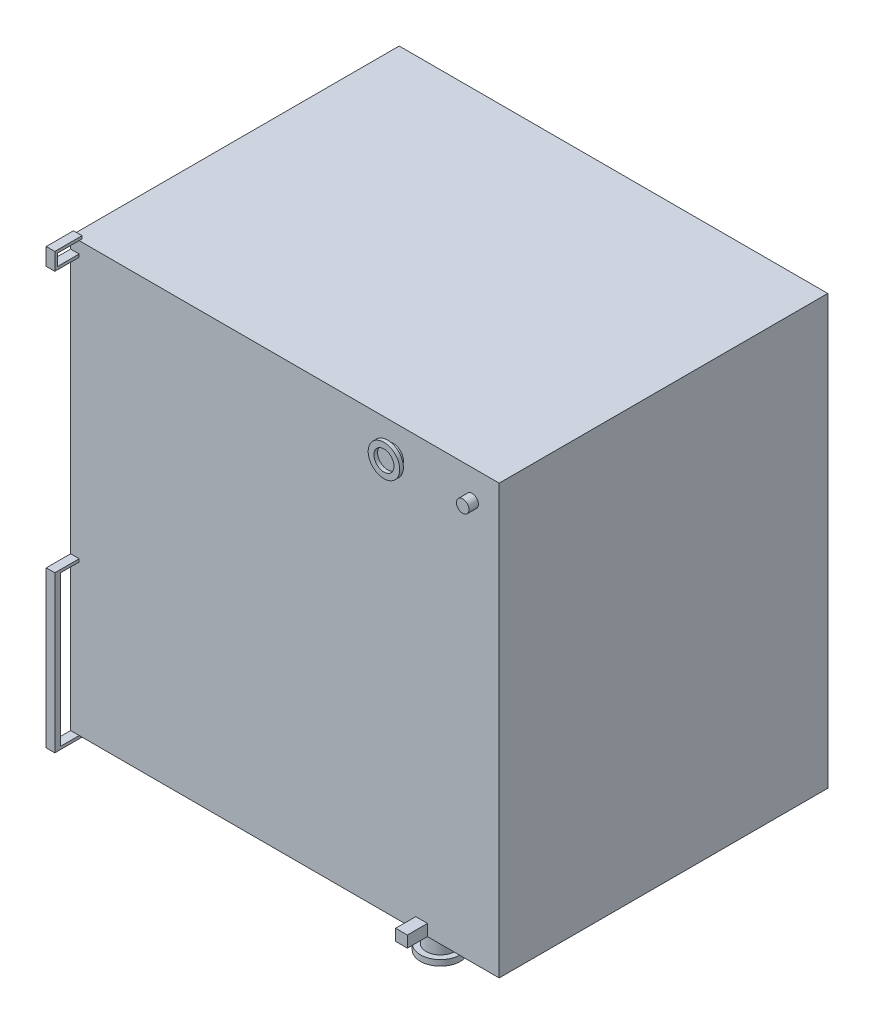
ISO-10303-21;
HEADER;
FILE_DESCRIPTION(('STEP AP214'),'2;1');
FILE_NAME('part.step','',(''),(''),'','','');
FILE_SCHEMA(('AUTOMOTIVE_DESIGN { 1 0 10303 214 1 1 1 1 }'));
ENDSEC;
DATA;
#1=APPLICATION_CONTEXT('core data for automotive mechanical design processes');
#2=APPLICATION_PROTOCOL_DEFINITION('international standard','automotive_design',2000,#1);
#3=PRODUCT_CONTEXT('',#1,'mechanical');
#4=PRODUCT('Part','Part','',(#3));
#5=PRODUCT_RELATED_PRODUCT_CATEGORY('part','',(#4));
#6=PRODUCT_DEFINITION_FORMATION('','',#4);
#7=PRODUCT_DEFINITION_CONTEXT('part definition',#1,'design');
#8=PRODUCT_DEFINITION('design','',#6,#7);
#9=PRODUCT_DEFINITION_SHAPE('','',#8);
#10=(LENGTH_UNIT() NAMED_UNIT(*) SI_UNIT(.MILLI.,.METRE.));
#11=(NAMED_UNIT(*) PLANE_ANGLE_UNIT() SI_UNIT($,.RADIAN.));
#12=(NAMED_UNIT(*) SI_UNIT($,.STERADIAN.) SOLID_ANGLE_UNIT());
#13=UNCERTAINTY_MEASURE_WITH_UNIT(LENGTH_MEASURE(1.E-05),#10,'distance_accuracy_value','');
#14=(GEOMETRIC_REPRESENTATION_CONTEXT(3) GLOBAL_UNCERTAINTY_ASSIGNED_CONTEXT((#13)) GLOBAL_UNIT_ASSIGNED_CONTEXT((#10,
#11,#12)) REPRESENTATION_CONTEXT('',''));
#15=CARTESIAN_POINT('',(0.,0.,0.));
#16=DIRECTION('',(0.,0.,1.));
#17=DIRECTION('',(1.,0.,0.));
#18=AXIS2_PLACEMENT_3D('',#15,#16,#17);
#19=CARTESIAN_POINT('',(-227.721378389106,611.304347826087,1183.));
#20=DIRECTION('',(0.,0.,1.));
#21=DIRECTION('',(1.,0.,0.));
#22=AXIS2_PLACEMENT_3D('',#19,#20,#21);
#23=PLANE('',#22);
#24=CARTESIAN_POINT('',(-227.721378389106,611.304347826087,1183.));
#25=DIRECTION('',(0.,0.,1.));
#26=DIRECTION('',(1.,0.,0.));
#27=AXIS2_PLACEMENT_3D('',#24,#25,#26);
#28=CIRCLE('',#27,55.1579836698314);
#29=CARTESIAN_POINT('',(-172.563394719274,611.304347826087,1183.));
#30=VERTEX_POINT('',#29);
#31=EDGE_CURVE('E12',#30,#30,#28,.T.);
#32=ORIENTED_EDGE('',*,*,#31,.T.);
#33=EDGE_LOOP('',(#32));
#34=FACE_BOUND('',#33,.T.);
#35=CARTESIAN_POINT('',(-227.721378389106,611.304347826087,1183.));
#36=DIRECTION('',(0.,0.,1.));
#37=DIRECTION('',(1.,0.,0.));
#38=AXIS2_PLACEMENT_3D('',#35,#36,#37);
#39=CIRCLE('',#38,35.1579836698314);
#40=CARTESIAN_POINT('',(-192.563394719274,611.304347826087,1183.));
#41=VERTEX_POINT('',#40);
#42=EDGE_CURVE('E137',#41,#41,#39,.T.);
#43=ORIENTED_EDGE('',*,*,#42,.F.);
#44=EDGE_LOOP('',(#43));
#45=FACE_BOUND('',#44,.T.);
#46=ADVANCED_FACE('F126',(#34,#45),#23,.T.);
#47=CARTESIAN_POINT('',(-227.721378389106,611.304347826087,1170.));
#48=DIRECTION('',(0.,0.,1.));
#49=DIRECTION('',(1.,0.,0.));
#50=AXIS2_PLACEMENT_3D('',#47,#48,#49);
#51=PLANE('',#50);
#52=CARTESIAN_POINT('',(-227.721378389106,611.304347826087,1170.));
#53=DIRECTION('',(0.,0.,1.));
#54=DIRECTION('',(1.,0.,0.));
#55=AXIS2_PLACEMENT_3D('',#52,#53,#54);
#56=CIRCLE('',#55,55.1579836698314);
#57=CARTESIAN_POINT('',(-172.563394719274,611.304347826087,1170.));
#58=VERTEX_POINT('',#57);
#59=EDGE_CURVE('E130',#58,#58,#56,.T.);
#60=ORIENTED_EDGE('',*,*,#59,.F.);
#61=EDGE_LOOP('',(#60));
#62=FACE_BOUND('',#61,.T.);
#63=CARTESIAN_POINT('',(-227.721378389106,611.304347826087,1170.));
#64=DIRECTION('',(0.,0.,1.));
#65=DIRECTION('',(1.,0.,0.));
#66=AXIS2_PLACEMENT_3D('',#63,#64,#65);
#67=CIRCLE('',#66,35.1579836698314);
#68=CARTESIAN_POINT('',(-192.563394719274,611.304347826087,1170.));
#69=VERTEX_POINT('',#68);
#70=EDGE_CURVE('E139',#69,#69,#67,.T.);
#71=ORIENTED_EDGE('',*,*,#70,.T.);
#72=EDGE_LOOP('',(#71));
#73=FACE_BOUND('',#72,.T.);
#74=ADVANCED_FACE('F149',(#62,#73),#51,.F.);
#75=CARTESIAN_POINT('',(-227.721378389106,611.304347826087,1183.));
#76=DIRECTION('',(0.,0.,-1.));
#77=DIRECTION('',(-1.,0.,0.));
#78=AXIS2_PLACEMENT_3D('',#75,#76,#77);
#79=CYLINDRICAL_SURFACE('',#78,55.1579836698314);
#80=ORIENTED_EDGE('',*,*,#31,.F.);
#81=EDGE_LOOP('',(#80));
#82=FACE_BOUND('',#81,.T.);
#83=ORIENTED_EDGE('',*,*,#59,.T.);
#84=EDGE_LOOP('',(#83));
#85=FACE_BOUND('',#84,.T.);
#86=ADVANCED_FACE('F128',(#82,#85),#79,.T.);
#87=CARTESIAN_POINT('',(-227.721378389106,611.304347826087,1183.));
#88=DIRECTION('',(0.,0.,-1.));
#89=DIRECTION('',(-1.,0.,0.));
#90=AXIS2_PLACEMENT_3D('',#87,#88,#89);
#91=CYLINDRICAL_SURFACE('',#90,35.1579836698314);
#92=ORIENTED_EDGE('',*,*,#42,.T.);
#93=EDGE_LOOP('',(#92));
#94=FACE_BOUND('',#93,.T.);
#95=ORIENTED_EDGE('',*,*,#70,.F.);
#96=EDGE_LOOP('',(#95));
#97=FACE_BOUND('',#96,.T.);
#98=ADVANCED_FACE('F145',(#94,#97),#91,.F.);
#99=CLOSED_SHELL('',(#46,#74,#86,#98));
#100=MANIFOLD_SOLID_BREP('B2',#99);
#101=CARTESIAN_POINT('',(-135.376748929389,-878.695652173913,1077.57144650962));
#102=DIRECTION('',(0.,-1.,0.));
#103=DIRECTION('',(0.,0.,-1.));
#104=AXIS2_PLACEMENT_3D('',#101,#102,#103);
#105=PLANE('',#104);
#106=CARTESIAN_POINT('',(-135.376748929389,-878.695652173913,1077.57144650962));
#107=DIRECTION('',(0.,-1.,0.));
#108=DIRECTION('',(0.,0.,-1.));
#109=AXIS2_PLACEMENT_3D('',#106,#107,#108);
#110=CIRCLE('',#109,70.);
#111=CARTESIAN_POINT('',(-135.376748929389,-878.695652173913,1007.57144650962));
#112=VERTEX_POINT('',#111);
#113=EDGE_CURVE('E125',#112,#112,#110,.T.);
#114=ORIENTED_EDGE('',*,*,#113,.T.);
#115=EDGE_LOOP('',(#114));
#116=FACE_BOUND('',#115,.T.);
#117=CARTESIAN_POINT('',(-135.376748929389,-878.695652173913,1077.57144650962));
#118=DIRECTION('',(0.,-1.,0.));
#119=DIRECTION('',(0.,0.,-1.));
#120=AXIS2_PLACEMENT_3D('',#117,#118,#119);
#121=CIRCLE('',#120,50.);
#122=CARTESIAN_POINT('',(-135.376748929389,-878.695652173913,1027.57144650962));
#123=VERTEX_POINT('',#122);
#124=EDGE_CURVE('E208',#123,#123,#121,.T.);
#125=ORIENTED_EDGE('',*,*,#124,.F.);
#126=EDGE_LOOP('',(#125));
#127=FACE_BOUND('',#126,.T.);
#128=ADVANCED_FACE('F197',(#116,#127),#105,.T.);
#129=CARTESIAN_POINT('',(-135.376748929389,-858.695652173913,1077.57144650962));
#130=DIRECTION('',(0.,-1.,0.));
#131=DIRECTION('',(0.,0.,-1.));
#132=AXIS2_PLACEMENT_3D('',#129,#130,#131);
#133=PLANE('',#132);
#134=CARTESIAN_POINT('',(-135.376748929389,-858.695652173913,1077.57144650962));
#135=DIRECTION('',(0.,-1.,0.));
#136=DIRECTION('',(0.,0.,-1.));
#137=AXIS2_PLACEMENT_3D('',#134,#135,#136);
#138=CIRCLE('',#137,70.);
#139=CARTESIAN_POINT('',(-135.376748929389,-858.695652173913,1007.57144650962));
#140=VERTEX_POINT('',#139);
#141=EDGE_CURVE('E201',#140,#140,#138,.T.);
#142=ORIENTED_EDGE('',*,*,#141,.F.);
#143=EDGE_LOOP('',(#142));
#144=FACE_BOUND('',#143,.T.);
#145=CARTESIAN_POINT('',(-135.376748929389,-858.695652173913,1077.57144650962));
#146=DIRECTION('',(0.,-1.,0.));
#147=DIRECTION('',(0.,0.,-1.));
#148=AXIS2_PLACEMENT_3D('',#145,#146,#147);
#149=CIRCLE('',#148,50.);
#150=CARTESIAN_POINT('',(-135.376748929389,-858.695652173913,1027.57144650962));
#151=VERTEX_POINT('',#150);
#152=EDGE_CURVE('E210',#151,#151,#149,.T.);
#153=ORIENTED_EDGE('',*,*,#152,.T.);
#154=EDGE_LOOP('',(#153));
#155=FACE_BOUND('',#154,.T.);
#156=ADVANCED_FACE('F220',(#144,#155),#133,.F.);
#157=CARTESIAN_POINT('',(-135.376748929389,-878.695652173913,1077.57144650962));
#158=DIRECTION('',(0.,1.,0.));
#159=DIRECTION('',(0.,0.,1.));
#160=AXIS2_PLACEMENT_3D('',#157,#158,#159);
#161=CYLINDRICAL_SURFACE('',#160,70.);
#162=ORIENTED_EDGE('',*,*,#113,.F.);
#163=EDGE_LOOP('',(#162));
#164=FACE_BOUND('',#163,.T.);
#165=ORIENTED_EDGE('',*,*,#141,.T.);
#166=EDGE_LOOP('',(#165));
#167=FACE_BOUND('',#166,.T.);
#168=ADVANCED_FACE('F199',(#164,#167),#161,.T.);
#169=CARTESIAN_POINT('',(-135.376748929389,-878.695652173913,1077.57144650962));
#170=DIRECTION('',(0.,1.,0.));
#171=DIRECTION('',(0.,0.,1.));
#172=AXIS2_PLACEMENT_3D('',#169,#170,#171);
#173=CYLINDRICAL_SURFACE('',#172,50.);
#174=ORIENTED_EDGE('',*,*,#124,.T.);
#175=EDGE_LOOP('',(#174));
#176=FACE_BOUND('',#175,.T.);
#177=ORIENTED_EDGE('',*,*,#152,.F.);
#178=EDGE_LOOP('',(#177));
#179=FACE_BOUND('',#178,.T.);
#180=ADVANCED_FACE('F216',(#176,#179),#173,.F.);
#181=CLOSED_SHELL('',(#128,#156,#168,#180));
#182=MANIFOLD_SOLID_BREP('B7',#181);
#183=CARTESIAN_POINT('',(-1357.39130434783,711.304347826087,1150.));
#184=DIRECTION('',(0.,-1.,0.));
#185=DIRECTION('',(0.,0.,-1.));
#186=AXIS2_PLACEMENT_3D('',#183,#184,#185);
#187=PLANE('',#186);
#188=DIRECTION('',(0.,0.,-1.));
#189=VECTOR('',#188,1.);
#190=CARTESIAN_POINT('',(-1327.39130434783,711.304347826087,1150.));
#191=LINE('',#190,#189);
#192=CARTESIAN_POINT('',(-1327.39130434783,711.304347826087,1150.));
#193=VERTEX_POINT('',#192);
#194=CARTESIAN_POINT('',(-1327.39130434783,711.304347826087,1140.));
#195=VERTEX_POINT('',#194);
#196=EDGE_CURVE('E585',#193,#195,#191,.T.);
#197=ORIENTED_EDGE('',*,*,#196,.F.);
#198=DIRECTION('',(-1.,0.,0.));
#199=VECTOR('',#198,1.);
#200=CARTESIAN_POINT('',(-1357.39130434783,711.304347826087,1150.));
#201=LINE('',#200,#199);
#202=CARTESIAN_POINT('',(142.608695652174,711.304347826087,1150.));
#203=VERTEX_POINT('',#202);
#204=EDGE_CURVE('E600',#203,#193,#201,.T.);
#205=ORIENTED_EDGE('',*,*,#204,.F.);
#206=DIRECTION('',(0.,0.,-1.));
#207=VECTOR('',#206,1.);
#208=CARTESIAN_POINT('',(142.608695652174,711.304347826087,1150.));
#209=LINE('',#208,#207);
#210=CARTESIAN_POINT('',(142.608695652174,711.304347826087,0.));
#211=VERTEX_POINT('',#210);
#212=EDGE_CURVE('E614',#203,#211,#209,.T.);
#213=ORIENTED_EDGE('',*,*,#212,.T.);
#214=DIRECTION('',(-1.,0.,0.));
#215=VECTOR('',#214,1.);
#216=CARTESIAN_POINT('',(-1357.39130434783,711.304347826087,0.));
#217=LINE('',#216,#215);
#218=CARTESIAN_POINT('',(-1357.39130434783,711.304347826087,0.));
#219=VERTEX_POINT('',#218);
#220=EDGE_CURVE('E610',#211,#219,#217,.T.);
#221=ORIENTED_EDGE('',*,*,#220,.T.);
#222=DIRECTION('',(0.,0.,-1.));
#223=VECTOR('',#222,1.);
#224=CARTESIAN_POINT('',(-1357.39130434783,711.304347826087,1150.));
#225=LINE('',#224,#223);
#226=CARTESIAN_POINT('',(-1357.39130434783,711.304347826087,1140.));
#227=VERTEX_POINT('',#226);
#228=EDGE_CURVE('E603',#227,#219,#225,.T.);
#229=ORIENTED_EDGE('',*,*,#228,.F.);
#230=DIRECTION('',(-1.,0.,0.));
#231=VECTOR('',#230,1.);
#232=CARTESIAN_POINT('',(-1357.39130434783,711.304347826087,1140.));
#233=LINE('',#232,#231);
#234=EDGE_CURVE('E625',#195,#227,#233,.T.);
#235=ORIENTED_EDGE('',*,*,#234,.F.);
#236=EDGE_LOOP('',(#197,#205,#213,#221,#229,#235));
#237=FACE_BOUND('',#236,.T.);
#238=ADVANCED_FACE('F259',(#237),#187,.F.);
#239=CARTESIAN_POINT('',(-1357.39130434783,711.304347826087,1150.));
#240=DIRECTION('',(1.,0.,0.));
#241=DIRECTION('',(0.,1.,0.));
#242=AXIS2_PLACEMENT_3D('',#239,#240,#241);
#243=PLANE('',#242);
#244=DIRECTION('',(0.,-1.,0.));
#245=VECTOR('',#244,1.);
#246=CARTESIAN_POINT('',(-1357.39130434783,711.304347826087,0.));
#247=LINE('',#246,#245);
#248=CARTESIAN_POINT('',(-1357.39130434783,-252.776990358454,0.));
#249=VERTEX_POINT('',#248);
#250=EDGE_CURVE('E587',#219,#249,#247,.T.);
#251=ORIENTED_EDGE('',*,*,#250,.T.);
#252=DIRECTION('',(0.,0.,1.));
#253=VECTOR('',#252,1.);
#254=CARTESIAN_POINT('',(-1357.39130434783,-252.776990358454,0.));
#255=LINE('',#254,#253);
#256=CARTESIAN_POINT('',(-1357.39130434783,-252.776990358454,-10.));
#257=VERTEX_POINT('',#256);
#258=EDGE_CURVE('E484',#257,#249,#255,.T.);
#259=ORIENTED_EDGE('',*,*,#258,.F.);
#260=DIRECTION('',(0.,1.,0.));
#261=VECTOR('',#260,1.);
#262=CARTESIAN_POINT('',(-1357.39130434783,-788.695652173914,-10.));
#263=LINE('',#262,#261);
#264=CARTESIAN_POINT('',(-1357.39130434783,-798.695652173914,-10.));
#265=VERTEX_POINT('',#264);
#266=EDGE_CURVE('E511',#257,#265,#263,.F.);
#267=ORIENTED_EDGE('',*,*,#266,.T.);
#268=DIRECTION('',(0.,0.,1.));
#269=VECTOR('',#268,1.);
#270=CARTESIAN_POINT('',(-1357.39130434783,-798.695652173914,0.));
#271=LINE('',#270,#269);
#272=CARTESIAN_POINT('',(-1357.39130434783,-798.695652173914,1235.3138537434));
#273=VERTEX_POINT('',#272);
#274=EDGE_CURVE('E477',#265,#273,#271,.T.);
#275=ORIENTED_EDGE('',*,*,#274,.T.);
#276=DIRECTION('',(0.,-1.,0.));
#277=VECTOR('',#276,1.);
#278=CARTESIAN_POINT('',(-1357.39130434783,-1.98592155928308E-13,1235.3138537434));
#279=LINE('',#278,#277);
#280=CARTESIAN_POINT('',(-1357.39130434783,-252.776990358454,1235.3138537434));
#281=VERTEX_POINT('',#280);
#282=EDGE_CURVE('E479',#281,#273,#279,.T.);
#283=ORIENTED_EDGE('',*,*,#282,.F.);
#284=CARTESIAN_POINT('',(-1357.39130434783,-252.776990358454,1150.));
#285=VERTEX_POINT('',#284);
#286=EDGE_CURVE('E483',#285,#281,#255,.T.);
#287=ORIENTED_EDGE('',*,*,#286,.F.);
#288=DIRECTION('',(0.,-1.,0.));
#289=VECTOR('',#288,1.);
#290=CARTESIAN_POINT('',(-1357.39130434783,711.304347826087,1150.));
#291=LINE('',#290,#289);
#292=CARTESIAN_POINT('',(-1357.39130434783,660.922038877819,1150.));
#293=VERTEX_POINT('',#292);
#294=EDGE_CURVE('E592',#293,#285,#291,.T.);
#295=ORIENTED_EDGE('',*,*,#294,.F.);
#296=DIRECTION('',(0.,0.,1.));
#297=VECTOR('',#296,1.);
#298=CARTESIAN_POINT('',(-1357.39130434783,660.922038877819,0.));
#299=LINE('',#298,#297);
#300=CARTESIAN_POINT('',(-1357.39130434783,660.922038877819,1235.3138537434));
#301=VERTEX_POINT('',#300);
#302=EDGE_CURVE('E575',#293,#301,#299,.T.);
#303=ORIENTED_EDGE('',*,*,#302,.T.);
#304=DIRECTION('',(0.,1.,0.));
#305=VECTOR('',#304,1.);
#306=CARTESIAN_POINT('',(-1357.39130434783,-1.98592155928308E-13,1235.3138537434));
#307=LINE('',#306,#305);
#308=CARTESIAN_POINT('',(-1357.39130434783,721.304347826086,1235.3138537434));
#309=VERTEX_POINT('',#308);
#310=EDGE_CURVE('E572',#301,#309,#307,.T.);
#311=ORIENTED_EDGE('',*,*,#310,.T.);
#312=DIRECTION('',(0.,0.,1.));
#313=VECTOR('',#312,1.);
#314=CARTESIAN_POINT('',(-1357.39130434783,721.304347826086,0.));
#315=LINE('',#314,#313);
#316=CARTESIAN_POINT('',(-1357.39130434783,721.304347826086,1140.));
#317=VERTEX_POINT('',#316);
#318=EDGE_CURVE('E558',#317,#309,#315,.T.);
#319=ORIENTED_EDGE('',*,*,#318,.F.);
#320=DIRECTION('',(0.,1.,0.));
#321=VECTOR('',#320,1.);
#322=CARTESIAN_POINT('',(-1357.39130434783,-1.98592155928308E-13,1140.));
#323=LINE('',#322,#321);
#324=EDGE_CURVE('E562',#227,#317,#323,.T.);
#325=ORIENTED_EDGE('',*,*,#324,.F.);
#326=ORIENTED_EDGE('',*,*,#228,.T.);
#327=EDGE_LOOP('',(#251,#259,#267,#275,#283,#287,#295,#303,#311,#319,#325,#326));
#328=FACE_BOUND('',#327,.T.);
#329=CARTESIAN_POINT('',(-1357.39130434783,711.304347826087,1150.));
#330=VERTEX_POINT('',#329);
#331=CARTESIAN_POINT('',(-1357.39130434783,670.922038877819,1150.));
#332=VERTEX_POINT('',#331);
#333=EDGE_CURVE('E588',#330,#332,#291,.T.);
#334=ORIENTED_EDGE('',*,*,#333,.F.);
#335=DIRECTION('',(0.,0.,1.));
#336=VECTOR('',#335,1.);
#337=CARTESIAN_POINT('',(-1357.39130434783,711.304347826086,0.));
#338=LINE('',#337,#336);
#339=CARTESIAN_POINT('',(-1357.39130434783,711.304347826086,1225.3138537434));
#340=VERTEX_POINT('',#339);
#341=EDGE_CURVE('E532',#330,#340,#338,.T.);
#342=ORIENTED_EDGE('',*,*,#341,.T.);
#343=DIRECTION('',(0.,1.,0.));
#344=VECTOR('',#343,1.);
#345=CARTESIAN_POINT('',(-1357.39130434783,-2.00046285701868E-13,1225.3138537434));
#346=LINE('',#345,#344);
#347=CARTESIAN_POINT('',(-1357.39130434783,670.922038877819,1225.3138537434));
#348=VERTEX_POINT('',#347);
#349=EDGE_CURVE('E545',#348,#340,#346,.T.);
#350=ORIENTED_EDGE('',*,*,#349,.F.);
#351=DIRECTION('',(0.,0.,1.));
#352=VECTOR('',#351,1.);
#353=CARTESIAN_POINT('',(-1357.39130434783,670.922038877819,0.));
#354=LINE('',#353,#352);
#355=EDGE_CURVE('E536',#332,#348,#354,.T.);
#356=ORIENTED_EDGE('',*,*,#355,.F.);
#357=EDGE_LOOP('',(#334,#342,#350,#356));
#358=FACE_BOUND('',#357,.T.);
#359=DIRECTION('',(0.,0.,1.));
#360=VECTOR('',#359,1.);
#361=CARTESIAN_POINT('',(-1357.39130434783,-788.695652173914,0.));
#362=LINE('',#361,#360);
#363=CARTESIAN_POINT('',(-1357.39130434783,-788.695652173914,1150.));
#364=VERTEX_POINT('',#363);
#365=CARTESIAN_POINT('',(-1357.39130434783,-788.695652173914,1215.3138537434));
#366=VERTEX_POINT('',#365);
#367=EDGE_CURVE('E504',#364,#366,#362,.T.);
#368=ORIENTED_EDGE('',*,*,#367,.F.);
#369=CARTESIAN_POINT('',(-1357.39130434783,-262.776990358454,1150.));
#370=VERTEX_POINT('',#369);
#371=EDGE_CURVE('E593',#370,#364,#291,.T.);
#372=ORIENTED_EDGE('',*,*,#371,.F.);
#373=DIRECTION('',(0.,0.,-1.));
#374=VECTOR('',#373,1.);
#375=CARTESIAN_POINT('',(-1357.39130434783,-262.776990358454,0.));
#376=LINE('',#375,#374);
#377=CARTESIAN_POINT('',(-1357.39130434783,-262.776990358454,1215.3138537434));
#378=VERTEX_POINT('',#377);
#379=EDGE_CURVE('E514',#378,#370,#376,.T.);
#380=ORIENTED_EDGE('',*,*,#379,.F.);
#381=DIRECTION('',(0.,1.,0.));
#382=VECTOR('',#381,1.);
#383=CARTESIAN_POINT('',(-1357.39130434783,-262.776990358454,1215.3138537434));
#384=LINE('',#383,#382);
#385=EDGE_CURVE('E473',#378,#366,#384,.F.);
#386=ORIENTED_EDGE('',*,*,#385,.T.);
#387=EDGE_LOOP('',(#368,#372,#380,#386));
#388=FACE_BOUND('',#387,.T.);
#389=ADVANCED_FACE('F261',(#328,#358,#388),#243,.F.);
#390=CARTESIAN_POINT('',(-1357.39130434783,-788.695652173913,1150.));
#391=DIRECTION('',(0.,1.,0.));
#392=DIRECTION('',(0.,0.,1.));
#393=AXIS2_PLACEMENT_3D('',#390,#391,#392);
#394=PLANE('',#393);
#395=CARTESIAN_POINT('',(-135.376748929389,-788.695652173913,1077.57144650962));
#396=DIRECTION('',(0.,1.,0.));
#397=DIRECTION('',(0.,0.,1.));
#398=AXIS2_PLACEMENT_3D('',#395,#396,#397);
#399=CIRCLE('',#398,50.);
#400=CARTESIAN_POINT('',(-135.376748929389,-788.695652173913,1127.57144650962));
#401=VERTEX_POINT('',#400);
#402=EDGE_CURVE('E195',#401,#401,#399,.F.);
#403=ORIENTED_EDGE('',*,*,#402,.F.);
#404=EDGE_LOOP('',(#403));
#405=FACE_BOUND('',#404,.T.);
#406=DIRECTION('',(1.,0.,0.));
#407=VECTOR('',#406,1.);
#408=CARTESIAN_POINT('',(-1357.39130434783,-788.695652173913,0.));
#409=LINE('',#408,#407);
#410=CARTESIAN_POINT('',(-1327.39130434783,-788.695652173914,0.));
#411=VERTEX_POINT('',#410);
#412=CARTESIAN_POINT('',(142.608695652175,-788.695652173913,0.));
#413=VERTEX_POINT('',#412);
#414=EDGE_CURVE('E606',#411,#413,#409,.T.);
#415=ORIENTED_EDGE('',*,*,#414,.T.);
#416=DIRECTION('',(0.,0.,-1.));
#417=VECTOR('',#416,1.);
#418=CARTESIAN_POINT('',(142.608695652175,-788.695652173913,1150.));
#419=LINE('',#418,#417);
#420=CARTESIAN_POINT('',(142.608695652175,-788.695652173913,1150.));
#421=VERTEX_POINT('',#420);
#422=EDGE_CURVE('E617',#421,#413,#419,.T.);
#423=ORIENTED_EDGE('',*,*,#422,.F.);
#424=DIRECTION('',(1.,0.,0.));
#425=VECTOR('',#424,1.);
#426=CARTESIAN_POINT('',(-1357.39130434783,-788.695652173913,1150.));
#427=LINE('',#426,#425);
#428=CARTESIAN_POINT('',(-108.379049225817,-788.695652173913,1150.));
#429=VERTEX_POINT('',#428);
#430=EDGE_CURVE('E591',#429,#421,#427,.T.);
#431=ORIENTED_EDGE('',*,*,#430,.F.);
#432=DIRECTION('',(0.,0.,1.));
#433=VECTOR('',#432,1.);
#434=CARTESIAN_POINT('',(-108.379049225817,-788.695652173913,0.));
#435=LINE('',#434,#433);
#436=CARTESIAN_POINT('',(-108.379049225817,-788.695652173913,1220.33009156254));
#437=VERTEX_POINT('',#436);
#438=EDGE_CURVE('E458',#429,#437,#435,.T.);
#439=ORIENTED_EDGE('',*,*,#438,.T.);
#440=DIRECTION('',(-1.,0.,0.));
#441=VECTOR('',#440,1.);
#442=CARTESIAN_POINT('',(-108.379049225817,-788.695652173913,1220.33009156254));
#443=LINE('',#442,#441);
#444=CARTESIAN_POINT('',(-149.405380108988,-788.695652173913,1220.33009156254));
#445=VERTEX_POINT('',#444);
#446=EDGE_CURVE('E447',#437,#445,#443,.T.);
#447=ORIENTED_EDGE('',*,*,#446,.T.);
#448=DIRECTION('',(0.,0.,-1.));
#449=VECTOR('',#448,1.);
#450=CARTESIAN_POINT('',(-149.405380108988,-788.695652173913,0.));
#451=LINE('',#450,#449);
#452=CARTESIAN_POINT('',(-149.405380108988,-788.695652173913,1150.));
#453=VERTEX_POINT('',#452);
#454=EDGE_CURVE('E441',#445,#453,#451,.T.);
#455=ORIENTED_EDGE('',*,*,#454,.T.);
#456=CARTESIAN_POINT('',(-1327.39130434783,-788.695652173914,1150.));
#457=VERTEX_POINT('',#456);
#458=EDGE_CURVE('E598',#457,#453,#427,.T.);
#459=ORIENTED_EDGE('',*,*,#458,.F.);
#460=DIRECTION('',(0.,0.,1.));
#461=VECTOR('',#460,1.);
#462=CARTESIAN_POINT('',(-1327.39130434783,-788.695652173914,0.));
#463=LINE('',#462,#461);
#464=EDGE_CURVE('E525',#411,#457,#463,.T.);
#465=ORIENTED_EDGE('',*,*,#464,.F.);
#466=EDGE_LOOP('',(#415,#423,#431,#439,#447,#455,#459,#465));
#467=FACE_BOUND('',#466,.T.);
#468=ADVANCED_FACE('F653',(#405,#467),#394,.F.);
#469=CARTESIAN_POINT('',(142.608695652174,711.304347826087,1150.));
#470=DIRECTION('',(-1.,0.,0.));
#471=DIRECTION('',(0.,-1.,0.));
#472=AXIS2_PLACEMENT_3D('',#469,#470,#471);
#473=PLANE('',#472);
#474=DIRECTION('',(0.,1.,0.));
#475=VECTOR('',#474,1.);
#476=CARTESIAN_POINT('',(142.608695652174,711.304347826087,0.));
#477=LINE('',#476,#475);
#478=EDGE_CURVE('E608',#413,#211,#477,.T.);
#479=ORIENTED_EDGE('',*,*,#478,.T.);
#480=ORIENTED_EDGE('',*,*,#212,.F.);
#481=DIRECTION('',(0.,1.,0.));
#482=VECTOR('',#481,1.);
#483=CARTESIAN_POINT('',(142.608695652174,711.304347826087,1150.));
#484=LINE('',#483,#482);
#485=EDGE_CURVE('E597',#421,#203,#484,.T.);
#486=ORIENTED_EDGE('',*,*,#485,.F.);
#487=ORIENTED_EDGE('',*,*,#422,.T.);
#488=EDGE_LOOP('',(#479,#480,#486,#487));
#489=FACE_BOUND('',#488,.T.);
#490=ADVANCED_FACE('F649',(#489),#473,.F.);
#491=CARTESIAN_POINT('',(0.,0.,1150.));
#492=DIRECTION('',(0.,0.,1.));
#493=DIRECTION('',(1.,0.,0.));
#494=AXIS2_PLACEMENT_3D('',#491,#492,#493);
#495=PLANE('',#494);
#496=CARTESIAN_POINT('',(47.9713932611361,610.858453258203,1150.));
#497=DIRECTION('',(0.,0.,1.));
#498=DIRECTION('',(1.,0.,0.));
#499=AXIS2_PLACEMENT_3D('',#496,#497,#498);
#500=CIRCLE('',#499,21.9642569751741);
#501=CARTESIAN_POINT('',(69.9356502363102,610.858453258203,1150.));
#502=VERTEX_POINT('',#501);
#503=EDGE_CURVE('E876',#502,#502,#500,.T.);
#504=ORIENTED_EDGE('',*,*,#503,.F.);
#505=EDGE_LOOP('',(#504));
#506=FACE_BOUND('',#505,.T.);
#507=CARTESIAN_POINT('',(-227.721378389106,611.304347826087,1150.));
#508=DIRECTION('',(0.,0.,1.));
#509=DIRECTION('',(1.,0.,0.));
#510=AXIS2_PLACEMENT_3D('',#507,#508,#509);
#511=CIRCLE('',#510,35.1579836698314);
#512=CARTESIAN_POINT('',(-192.563394719274,611.304347826087,1150.));
#513=VERTEX_POINT('',#512);
#514=EDGE_CURVE('E875',#513,#513,#511,.T.);
#515=ORIENTED_EDGE('',*,*,#514,.F.);
#516=EDGE_LOOP('',(#515));
#517=FACE_BOUND('',#516,.T.);
#518=DIRECTION('',(0.,1.,0.));
#519=VECTOR('',#518,1.);
#520=CARTESIAN_POINT('',(-108.379049225817,0.,1150.));
#521=LINE('',#520,#519);
#522=CARTESIAN_POINT('',(-108.379049225817,-748.695652173913,1150.));
#523=VERTEX_POINT('',#522);
#524=EDGE_CURVE('E437',#429,#523,#521,.T.);
#525=ORIENTED_EDGE('',*,*,#524,.F.);
#526=ORIENTED_EDGE('',*,*,#430,.T.);
#527=ORIENTED_EDGE('',*,*,#485,.T.);
#528=ORIENTED_EDGE('',*,*,#204,.T.);
#529=DIRECTION('',(-1.,0.,0.));
#530=VECTOR('',#529,1.);
#531=CARTESIAN_POINT('',(-1327.39130434783,711.304347826087,1150.));
#532=LINE('',#531,#530);
#533=EDGE_CURVE('E542',#193,#330,#532,.T.);
#534=ORIENTED_EDGE('',*,*,#533,.T.);
#535=ORIENTED_EDGE('',*,*,#333,.T.);
#536=DIRECTION('',(-1.,0.,0.));
#537=VECTOR('',#536,1.);
#538=CARTESIAN_POINT('',(-1327.39130434783,670.922038877819,1150.));
#539=LINE('',#538,#537);
#540=CARTESIAN_POINT('',(-1327.39130434783,670.922038877819,1150.));
#541=VERTEX_POINT('',#540);
#542=EDGE_CURVE('E552',#541,#332,#539,.T.);
#543=ORIENTED_EDGE('',*,*,#542,.F.);
#544=DIRECTION('',(0.,-1.,0.));
#545=VECTOR('',#544,1.);
#546=CARTESIAN_POINT('',(-1327.39130434783,-1.95625019297823E-13,1150.));
#547=LINE('',#546,#545);
#548=CARTESIAN_POINT('',(-1327.39130434783,660.922038877819,1150.));
#549=VERTEX_POINT('',#548);
#550=EDGE_CURVE('E620',#541,#549,#547,.T.);
#551=ORIENTED_EDGE('',*,*,#550,.T.);
#552=DIRECTION('',(1.,0.,0.));
#553=VECTOR('',#552,1.);
#554=CARTESIAN_POINT('',(0.,660.922038877819,1150.));
#555=LINE('',#554,#553);
#556=EDGE_CURVE('E623',#293,#549,#555,.T.);
#557=ORIENTED_EDGE('',*,*,#556,.F.);
#558=ORIENTED_EDGE('',*,*,#294,.T.);
#559=DIRECTION('',(-1.,0.,0.));
#560=VECTOR('',#559,1.);
#561=CARTESIAN_POINT('',(0.,-252.776990358454,1150.));
#562=LINE('',#561,#560);
#563=CARTESIAN_POINT('',(-1327.39130434783,-252.776990358454,1150.));
#564=VERTEX_POINT('',#563);
#565=EDGE_CURVE('E529',#564,#285,#562,.T.);
#566=ORIENTED_EDGE('',*,*,#565,.F.);
#567=DIRECTION('',(0.,1.,0.));
#568=VECTOR('',#567,1.);
#569=CARTESIAN_POINT('',(-1327.39130434783,-1.47370038877417E-13,1150.));
#570=LINE('',#569,#568);
#571=CARTESIAN_POINT('',(-1327.39130434783,-262.776990358454,1150.));
#572=VERTEX_POINT('',#571);
#573=EDGE_CURVE('E486',#572,#564,#570,.T.);
#574=ORIENTED_EDGE('',*,*,#573,.F.);
#575=DIRECTION('',(-1.,0.,0.));
#576=VECTOR('',#575,1.);
#577=CARTESIAN_POINT('',(-1327.39130434783,-262.776990358454,1150.));
#578=LINE('',#577,#576);
#579=EDGE_CURVE('E493',#572,#370,#578,.T.);
#580=ORIENTED_EDGE('',*,*,#579,.T.);
#581=ORIENTED_EDGE('',*,*,#371,.T.);
#582=EDGE_CURVE('E594',#364,#457,#427,.T.);
#583=ORIENTED_EDGE('',*,*,#582,.T.);
#584=ORIENTED_EDGE('',*,*,#458,.T.);
#585=DIRECTION('',(0.,-1.,0.));
#586=VECTOR('',#585,1.);
#587=CARTESIAN_POINT('',(-149.405380108988,0.,1150.));
#588=LINE('',#587,#586);
#589=CARTESIAN_POINT('',(-149.405380108988,-748.695652173913,1150.));
#590=VERTEX_POINT('',#589);
#591=EDGE_CURVE('E279',#590,#453,#588,.T.);
#592=ORIENTED_EDGE('',*,*,#591,.F.);
#593=DIRECTION('',(1.,0.,0.));
#594=VECTOR('',#593,1.);
#595=CARTESIAN_POINT('',(0.,-748.695652173913,1150.));
#596=LINE('',#595,#594);
#597=EDGE_CURVE('E274',#590,#523,#596,.T.);
#598=ORIENTED_EDGE('',*,*,#597,.T.);
#599=EDGE_LOOP('',(#525,#526,#527,#528,#534,#535,#543,#551,#557,#558,#566,#574,#580,#581,#583,
#584,#592,#598));
#600=FACE_BOUND('',#599,.T.);
#601=ADVANCED_FACE('F674',(#506,#517,#600),#495,.T.);
#602=CARTESIAN_POINT('',(0.,0.,0.));
#603=DIRECTION('',(0.,0.,1.));
#604=DIRECTION('',(1.,0.,0.));
#605=AXIS2_PLACEMENT_3D('',#602,#603,#604);
#606=PLANE('',#605);
#607=ORIENTED_EDGE('',*,*,#478,.F.);
#608=ORIENTED_EDGE('',*,*,#414,.F.);
#609=DIRECTION('',(0.,1.,0.));
#610=VECTOR('',#609,1.);
#611=CARTESIAN_POINT('',(-1327.39130434783,-1.47370038877417E-13,0.));
#612=LINE('',#611,#610);
#613=CARTESIAN_POINT('',(-1327.39130434783,-252.776990358454,0.));
#614=VERTEX_POINT('',#613);
#615=EDGE_CURVE('E627',#411,#614,#612,.T.);
#616=ORIENTED_EDGE('',*,*,#615,.T.);
#617=DIRECTION('',(-1.,0.,0.));
#618=VECTOR('',#617,1.);
#619=CARTESIAN_POINT('',(0.,-252.776990358454,0.));
#620=LINE('',#619,#618);
#621=EDGE_CURVE('E267',#614,#249,#620,.T.);
#622=ORIENTED_EDGE('',*,*,#621,.T.);
#623=ORIENTED_EDGE('',*,*,#250,.F.);
#624=ORIENTED_EDGE('',*,*,#220,.F.);
#625=EDGE_LOOP('',(#607,#608,#616,#622,#623,#624));
#626=FACE_BOUND('',#625,.T.);
#627=ADVANCED_FACE('F634',(#626),#606,.F.);
#628=CARTESIAN_POINT('',(-1327.39130434783,-1.95261486854433E-13,1140.));
#629=DIRECTION('',(0.,0.,1.));
#630=DIRECTION('',(1.,0.,0.));
#631=AXIS2_PLACEMENT_3D('',#628,#629,#630);
#632=PLANE('',#631);
#633=DIRECTION('',(0.,1.,0.));
#634=VECTOR('',#633,1.);
#635=CARTESIAN_POINT('',(-1327.39130434783,-1.95261486854433E-13,1140.));
#636=LINE('',#635,#634);
#637=CARTESIAN_POINT('',(-1327.39130434783,721.304347826086,1140.));
#638=VERTEX_POINT('',#637);
#639=EDGE_CURVE('E567',#195,#638,#636,.T.);
#640=ORIENTED_EDGE('',*,*,#639,.F.);
#641=ORIENTED_EDGE('',*,*,#234,.T.);
#642=ORIENTED_EDGE('',*,*,#324,.T.);
#643=DIRECTION('',(-1.,0.,0.));
#644=VECTOR('',#643,1.);
#645=CARTESIAN_POINT('',(-1327.39130434783,721.304347826086,1140.));
#646=LINE('',#645,#644);
#647=EDGE_CURVE('E569',#638,#317,#646,.T.);
#648=ORIENTED_EDGE('',*,*,#647,.F.);
#649=EDGE_LOOP('',(#640,#641,#642,#648));
#650=FACE_BOUND('',#649,.T.);
#651=ADVANCED_FACE('F898',(#650),#632,.F.);
#652=CARTESIAN_POINT('',(-1327.39130434783,-1.96715616627993E-13,0.));
#653=DIRECTION('',(-1.,0.,0.));
#654=DIRECTION('',(0.,-1.,0.));
#655=AXIS2_PLACEMENT_3D('',#652,#653,#654);
#656=PLANE('',#655);
#657=DIRECTION('',(0.,0.,1.));
#658=VECTOR('',#657,1.);
#659=CARTESIAN_POINT('',(-1327.39130434783,711.304347826086,0.));
#660=LINE('',#659,#658);
#661=CARTESIAN_POINT('',(-1327.39130434783,711.304347826086,1225.3138537434));
#662=VERTEX_POINT('',#661);
#663=EDGE_CURVE('E533',#193,#662,#660,.T.);
#664=ORIENTED_EDGE('',*,*,#663,.F.);
#665=ORIENTED_EDGE('',*,*,#196,.T.);
#666=ORIENTED_EDGE('',*,*,#639,.T.);
#667=DIRECTION('',(0.,0.,1.));
#668=VECTOR('',#667,1.);
#669=CARTESIAN_POINT('',(-1327.39130434783,721.304347826086,0.));
#670=LINE('',#669,#668);
#671=CARTESIAN_POINT('',(-1327.39130434783,721.304347826086,1235.3138537434));
#672=VERTEX_POINT('',#671);
#673=EDGE_CURVE('E559',#638,#672,#670,.T.);
#674=ORIENTED_EDGE('',*,*,#673,.T.);
#675=DIRECTION('',(0.,1.,0.));
#676=VECTOR('',#675,1.);
#677=CARTESIAN_POINT('',(-1327.39130434783,-1.95261486854433E-13,1235.3138537434));
#678=LINE('',#677,#676);
#679=CARTESIAN_POINT('',(-1327.39130434783,660.922038877819,1235.3138537434));
#680=VERTEX_POINT('',#679);
#681=EDGE_CURVE('E561',#680,#672,#678,.T.);
#682=ORIENTED_EDGE('',*,*,#681,.F.);
#683=DIRECTION('',(0.,0.,1.));
#684=VECTOR('',#683,1.);
#685=CARTESIAN_POINT('',(-1327.39130434783,660.922038877819,0.));
#686=LINE('',#685,#684);
#687=EDGE_CURVE('E565',#549,#680,#686,.T.);
#688=ORIENTED_EDGE('',*,*,#687,.F.);
#689=ORIENTED_EDGE('',*,*,#550,.F.);
#690=DIRECTION('',(0.,0.,1.));
#691=VECTOR('',#690,1.);
#692=CARTESIAN_POINT('',(-1327.39130434783,670.922038877819,0.));
#693=LINE('',#692,#691);
#694=CARTESIAN_POINT('',(-1327.39130434783,670.922038877819,1225.3138537434));
#695=VERTEX_POINT('',#694);
#696=EDGE_CURVE('E539',#541,#695,#693,.T.);
#697=ORIENTED_EDGE('',*,*,#696,.T.);
#698=DIRECTION('',(0.,1.,0.));
#699=VECTOR('',#698,1.);
#700=CARTESIAN_POINT('',(-1327.39130434783,-1.96715616627993E-13,1225.3138537434));
#701=LINE('',#700,#699);
#702=EDGE_CURVE('E535',#695,#662,#701,.T.);
#703=ORIENTED_EDGE('',*,*,#702,.T.);
#704=EDGE_LOOP('',(#664,#665,#666,#674,#682,#688,#689,#697,#703));
#705=FACE_BOUND('',#704,.T.);
#706=ADVANCED_FACE('F903',(#705),#656,.F.);
#707=CARTESIAN_POINT('',(-1327.39130434783,721.304347826086,0.));
#708=DIRECTION('',(0.,-1.,0.));
#709=DIRECTION('',(1.,0.,0.));
#710=AXIS2_PLACEMENT_3D('',#707,#708,#709);
#711=PLANE('',#710);
#712=ORIENTED_EDGE('',*,*,#318,.T.);
#713=DIRECTION('',(-1.,0.,0.));
#714=VECTOR('',#713,1.);
#715=CARTESIAN_POINT('',(-1327.39130434783,721.304347826086,1235.3138537434));
#716=LINE('',#715,#714);
#717=EDGE_CURVE('E583',#672,#309,#716,.T.);
#718=ORIENTED_EDGE('',*,*,#717,.F.);
#719=ORIENTED_EDGE('',*,*,#673,.F.);
#720=ORIENTED_EDGE('',*,*,#647,.T.);
#721=EDGE_LOOP('',(#712,#718,#719,#720));
#722=FACE_BOUND('',#721,.T.);
#723=ADVANCED_FACE('F912',(#722),#711,.F.);
#724=CARTESIAN_POINT('',(-1327.39130434783,-1.95261486854433E-13,1235.3138537434));
#725=DIRECTION('',(0.,0.,1.));
#726=DIRECTION('',(1.,0.,0.));
#727=AXIS2_PLACEMENT_3D('',#724,#725,#726);
#728=PLANE('',#727);
#729=ORIENTED_EDGE('',*,*,#310,.F.);
#730=DIRECTION('',(-1.,0.,0.));
#731=VECTOR('',#730,1.);
#732=CARTESIAN_POINT('',(-1327.39130434783,660.922038877819,1235.3138537434));
#733=LINE('',#732,#731);
#734=EDGE_CURVE('E580',#680,#301,#733,.T.);
#735=ORIENTED_EDGE('',*,*,#734,.F.);
#736=ORIENTED_EDGE('',*,*,#681,.T.);
#737=ORIENTED_EDGE('',*,*,#717,.T.);
#738=EDGE_LOOP('',(#729,#735,#736,#737));
#739=FACE_BOUND('',#738,.T.);
#740=ADVANCED_FACE('F920',(#739),#728,.T.);
#741=CARTESIAN_POINT('',(-1327.39130434783,660.922038877819,0.));
#742=DIRECTION('',(0.,-1.,0.));
#743=DIRECTION('',(1.,0.,0.));
#744=AXIS2_PLACEMENT_3D('',#741,#742,#743);
#745=PLANE('',#744);
#746=ORIENTED_EDGE('',*,*,#302,.F.);
#747=ORIENTED_EDGE('',*,*,#556,.T.);
#748=ORIENTED_EDGE('',*,*,#687,.T.);
#749=ORIENTED_EDGE('',*,*,#734,.T.);
#750=EDGE_LOOP('',(#746,#747,#748,#749));
#751=FACE_BOUND('',#750,.T.);
#752=ADVANCED_FACE('F928',(#751),#745,.T.);
#753=CARTESIAN_POINT('',(-1327.39130434783,711.304347826086,0.));
#754=DIRECTION('',(0.,-1.,0.));
#755=DIRECTION('',(1.,0.,0.));
#756=AXIS2_PLACEMENT_3D('',#753,#754,#755);
#757=PLANE('',#756);
#758=ORIENTED_EDGE('',*,*,#341,.F.);
#759=ORIENTED_EDGE('',*,*,#533,.F.);
#760=ORIENTED_EDGE('',*,*,#663,.T.);
#761=DIRECTION('',(-1.,0.,0.));
#762=VECTOR('',#761,1.);
#763=CARTESIAN_POINT('',(-1327.39130434783,711.304347826086,1225.3138537434));
#764=LINE('',#763,#762);
#765=EDGE_CURVE('E556',#662,#340,#764,.T.);
#766=ORIENTED_EDGE('',*,*,#765,.T.);
#767=EDGE_LOOP('',(#758,#759,#760,#766));
#768=FACE_BOUND('',#767,.T.);
#769=ADVANCED_FACE('F936',(#768),#757,.T.);
#770=CARTESIAN_POINT('',(-1327.39130434783,-1.96715616627993E-13,1225.3138537434));
#771=DIRECTION('',(0.,0.,1.));
#772=DIRECTION('',(1.,0.,0.));
#773=AXIS2_PLACEMENT_3D('',#770,#771,#772);
#774=PLANE('',#773);
#775=ORIENTED_EDGE('',*,*,#349,.T.);
#776=ORIENTED_EDGE('',*,*,#765,.F.);
#777=ORIENTED_EDGE('',*,*,#702,.F.);
#778=DIRECTION('',(-1.,0.,0.));
#779=VECTOR('',#778,1.);
#780=CARTESIAN_POINT('',(-1327.39130434783,670.922038877819,1225.3138537434));
#781=LINE('',#780,#779);
#782=EDGE_CURVE('E554',#695,#348,#781,.T.);
#783=ORIENTED_EDGE('',*,*,#782,.T.);
#784=EDGE_LOOP('',(#775,#776,#777,#783));
#785=FACE_BOUND('',#784,.T.);
#786=ADVANCED_FACE('F705',(#785),#774,.F.);
#787=CARTESIAN_POINT('',(-1327.39130434783,670.922038877819,0.));
#788=DIRECTION('',(0.,-1.,0.));
#789=DIRECTION('',(1.,0.,0.));
#790=AXIS2_PLACEMENT_3D('',#787,#788,#789);
#791=PLANE('',#790);
#792=ORIENTED_EDGE('',*,*,#355,.T.);
#793=ORIENTED_EDGE('',*,*,#782,.F.);
#794=ORIENTED_EDGE('',*,*,#696,.F.);
#795=ORIENTED_EDGE('',*,*,#542,.T.);
#796=EDGE_LOOP('',(#792,#793,#794,#795));
#797=FACE_BOUND('',#796,.T.);
#798=ADVANCED_FACE('F698',(#797),#791,.F.);
#799=CARTESIAN_POINT('',(-1327.39130434783,-252.776990358454,0.));
#800=DIRECTION('',(0.,1.,0.));
#801=DIRECTION('',(-1.,0.,0.));
#802=AXIS2_PLACEMENT_3D('',#799,#800,#801);
#803=PLANE('',#802);
#804=ORIENTED_EDGE('',*,*,#621,.F.);
#805=DIRECTION('',(0.,0.,1.));
#806=VECTOR('',#805,1.);
#807=CARTESIAN_POINT('',(-1327.39130434783,-252.776990358454,0.));
#808=LINE('',#807,#806);
#809=CARTESIAN_POINT('',(-1327.39130434783,-252.776990358454,-10.));
#810=VERTEX_POINT('',#809);
#811=EDGE_CURVE('E480',#810,#614,#808,.T.);
#812=ORIENTED_EDGE('',*,*,#811,.F.);
#813=DIRECTION('',(-1.,0.,0.));
#814=VECTOR('',#813,1.);
#815=CARTESIAN_POINT('',(-1327.39130434783,-252.776990358454,-10.));
#816=LINE('',#815,#814);
#817=EDGE_CURVE('E505',#810,#257,#816,.T.);
#818=ORIENTED_EDGE('',*,*,#817,.T.);
#819=ORIENTED_EDGE('',*,*,#258,.T.);
#820=EDGE_LOOP('',(#804,#812,#818,#819));
#821=FACE_BOUND('',#820,.T.);
#822=ADVANCED_FACE('F696',(#821),#803,.T.);
#823=CARTESIAN_POINT('',(-1327.39130434783,-1.97603608194515E-13,0.));
#824=DIRECTION('',(1.,0.,0.));
#825=DIRECTION('',(0.,0.,-1.));
#826=AXIS2_PLACEMENT_3D('',#823,#824,#825);
#827=PLANE('',#826);
#828=ORIENTED_EDGE('',*,*,#464,.T.);
#829=CARTESIAN_POINT('',(-1327.39130434783,-788.695652173914,1215.3138537434));
#830=VERTEX_POINT('',#829);
#831=EDGE_CURVE('E515',#457,#830,#463,.T.);
#832=ORIENTED_EDGE('',*,*,#831,.T.);
#833=DIRECTION('',(0.,1.,0.));
#834=VECTOR('',#833,1.);
#835=CARTESIAN_POINT('',(-1327.39130434783,-262.776990358454,1215.3138537434));
#836=LINE('',#835,#834);
#837=CARTESIAN_POINT('',(-1327.39130434783,-262.776990358454,1215.3138537434));
#838=VERTEX_POINT('',#837);
#839=EDGE_CURVE('E501',#838,#830,#836,.F.);
#840=ORIENTED_EDGE('',*,*,#839,.F.);
#841=DIRECTION('',(0.,0.,-1.));
#842=VECTOR('',#841,1.);
#843=CARTESIAN_POINT('',(-1327.39130434783,-262.776990358454,0.));
#844=LINE('',#843,#842);
#845=EDGE_CURVE('E522',#838,#572,#844,.T.);
#846=ORIENTED_EDGE('',*,*,#845,.T.);
#847=ORIENTED_EDGE('',*,*,#573,.T.);
#848=CARTESIAN_POINT('',(-1327.39130434783,-252.776990358454,1235.3138537434));
#849=VERTEX_POINT('',#848);
#850=EDGE_CURVE('E491',#564,#849,#808,.T.);
#851=ORIENTED_EDGE('',*,*,#850,.T.);
#852=DIRECTION('',(0.,-1.,0.));
#853=VECTOR('',#852,1.);
#854=CARTESIAN_POINT('',(-1327.39130434783,-1.95261486854433E-13,1235.3138537434));
#855=LINE('',#854,#853);
#856=CARTESIAN_POINT('',(-1327.39130434783,-798.695652173914,1235.3138537434));
#857=VERTEX_POINT('',#856);
#858=EDGE_CURVE('E488',#849,#857,#855,.T.);
#859=ORIENTED_EDGE('',*,*,#858,.T.);
#860=DIRECTION('',(0.,0.,1.));
#861=VECTOR('',#860,1.);
#862=CARTESIAN_POINT('',(-1327.39130434783,-798.695652173914,0.));
#863=LINE('',#862,#861);
#864=CARTESIAN_POINT('',(-1327.39130434783,-798.695652173914,-10.));
#865=VERTEX_POINT('',#864);
#866=EDGE_CURVE('E476',#865,#857,#863,.T.);
#867=ORIENTED_EDGE('',*,*,#866,.F.);
#868=DIRECTION('',(0.,1.,0.));
#869=VECTOR('',#868,1.);
#870=CARTESIAN_POINT('',(-1327.39130434783,-788.695652173914,-10.));
#871=LINE('',#870,#869);
#872=EDGE_CURVE('E508',#810,#865,#871,.F.);
#873=ORIENTED_EDGE('',*,*,#872,.F.);
#874=ORIENTED_EDGE('',*,*,#811,.T.);
#875=ORIENTED_EDGE('',*,*,#615,.F.);
#876=EDGE_LOOP('',(#828,#832,#840,#846,#847,#851,#859,#867,#873,#874,#875));
#877=FACE_BOUND('',#876,.T.);
#878=ADVANCED_FACE('F659',(#877),#827,.T.);
#879=CARTESIAN_POINT('',(-1327.39130434783,-262.776990358454,0.));
#880=DIRECTION('',(0.,1.,0.));
#881=DIRECTION('',(-1.,0.,0.));
#882=AXIS2_PLACEMENT_3D('',#879,#880,#881);
#883=PLANE('',#882);
#884=ORIENTED_EDGE('',*,*,#845,.F.);
#885=DIRECTION('',(-1.,0.,0.));
#886=VECTOR('',#885,1.);
#887=CARTESIAN_POINT('',(-1327.39130434783,-262.776990358454,1215.3138537434));
#888=LINE('',#887,#886);
#889=EDGE_CURVE('E468',#838,#378,#888,.T.);
#890=ORIENTED_EDGE('',*,*,#889,.T.);
#891=ORIENTED_EDGE('',*,*,#379,.T.);
#892=ORIENTED_EDGE('',*,*,#579,.F.);
#893=EDGE_LOOP('',(#884,#890,#891,#892));
#894=FACE_BOUND('',#893,.T.);
#895=ADVANCED_FACE('F670',(#894),#883,.F.);
#896=ORIENTED_EDGE('',*,*,#850,.F.);
#897=ORIENTED_EDGE('',*,*,#565,.T.);
#898=ORIENTED_EDGE('',*,*,#286,.T.);
#899=DIRECTION('',(-1.,0.,0.));
#900=VECTOR('',#899,1.);
#901=CARTESIAN_POINT('',(-1327.39130434783,-252.776990358454,1235.3138537434));
#902=LINE('',#901,#900);
#903=EDGE_CURVE('E469',#849,#281,#902,.T.);
#904=ORIENTED_EDGE('',*,*,#903,.F.);
#905=EDGE_LOOP('',(#896,#897,#898,#904));
#906=FACE_BOUND('',#905,.T.);
#907=ADVANCED_FACE('F681',(#906),#803,.T.);
#908=CARTESIAN_POINT('',(-1327.39130434783,-788.695652173914,0.));
#909=DIRECTION('',(0.,-1.,0.));
#910=DIRECTION('',(1.,0.,0.));
#911=AXIS2_PLACEMENT_3D('',#908,#909,#910);
#912=PLANE('',#911);
#913=DIRECTION('',(-1.,0.,0.));
#914=VECTOR('',#913,1.);
#915=CARTESIAN_POINT('',(-1327.39130434783,-788.695652173914,1215.3138537434));
#916=LINE('',#915,#914);
#917=EDGE_CURVE('E495',#830,#366,#916,.T.);
#918=ORIENTED_EDGE('',*,*,#917,.F.);
#919=ORIENTED_EDGE('',*,*,#831,.F.);
#920=ORIENTED_EDGE('',*,*,#582,.F.);
#921=ORIENTED_EDGE('',*,*,#367,.T.);
#922=EDGE_LOOP('',(#918,#919,#920,#921));
#923=FACE_BOUND('',#922,.T.);
#924=ADVANCED_FACE('F662',(#923),#912,.F.);
#925=CARTESIAN_POINT('',(-1327.39130434783,-798.695652173914,0.));
#926=DIRECTION('',(0.,-1.,0.));
#927=DIRECTION('',(1.,0.,0.));
#928=AXIS2_PLACEMENT_3D('',#925,#926,#927);
#929=PLANE('',#928);
#930=ORIENTED_EDGE('',*,*,#274,.F.);
#931=DIRECTION('',(-1.,0.,0.));
#932=VECTOR('',#931,1.);
#933=CARTESIAN_POINT('',(-1327.39130434783,-798.695652173914,-10.));
#934=LINE('',#933,#932);
#935=EDGE_CURVE('E497',#865,#265,#934,.T.);
#936=ORIENTED_EDGE('',*,*,#935,.F.);
#937=ORIENTED_EDGE('',*,*,#866,.T.);
#938=DIRECTION('',(-1.,0.,0.));
#939=VECTOR('',#938,1.);
#940=CARTESIAN_POINT('',(-1327.39130434783,-798.695652173914,1235.3138537434));
#941=LINE('',#940,#939);
#942=EDGE_CURVE('E472',#857,#273,#941,.T.);
#943=ORIENTED_EDGE('',*,*,#942,.T.);
#944=EDGE_LOOP('',(#930,#936,#937,#943));
#945=FACE_BOUND('',#944,.T.);
#946=ADVANCED_FACE('F691',(#945),#929,.T.);
#947=CARTESIAN_POINT('',(-1327.39130434783,-1.95261486854433E-13,1235.3138537434));
#948=DIRECTION('',(0.,0.,-1.));
#949=DIRECTION('',(-1.,0.,0.));
#950=AXIS2_PLACEMENT_3D('',#947,#948,#949);
#951=PLANE('',#950);
#952=ORIENTED_EDGE('',*,*,#282,.T.);
#953=ORIENTED_EDGE('',*,*,#942,.F.);
#954=ORIENTED_EDGE('',*,*,#858,.F.);
#955=ORIENTED_EDGE('',*,*,#903,.T.);
#956=EDGE_LOOP('',(#952,#953,#954,#955));
#957=FACE_BOUND('',#956,.T.);
#958=ADVANCED_FACE('F687',(#957),#951,.F.);
#959=CARTESIAN_POINT('',(-1327.39130434783,-262.776990358454,1215.3138537434));
#960=DIRECTION('',(0.,0.,-1.));
#961=DIRECTION('',(-1.,0.,0.));
#962=AXIS2_PLACEMENT_3D('',#959,#960,#961);
#963=PLANE('',#962);
#964=ORIENTED_EDGE('',*,*,#385,.F.);
#965=ORIENTED_EDGE('',*,*,#889,.F.);
#966=ORIENTED_EDGE('',*,*,#839,.T.);
#967=ORIENTED_EDGE('',*,*,#917,.T.);
#968=EDGE_LOOP('',(#964,#965,#966,#967));
#969=FACE_BOUND('',#968,.T.);
#970=ADVANCED_FACE('F666',(#969),#963,.T.);
#971=CARTESIAN_POINT('',(-1327.39130434783,-788.695652173914,-10.));
#972=DIRECTION('',(0.,0.,-1.));
#973=DIRECTION('',(-1.,0.,0.));
#974=AXIS2_PLACEMENT_3D('',#971,#972,#973);
#975=PLANE('',#974);
#976=ORIENTED_EDGE('',*,*,#266,.F.);
#977=ORIENTED_EDGE('',*,*,#817,.F.);
#978=ORIENTED_EDGE('',*,*,#872,.T.);
#979=ORIENTED_EDGE('',*,*,#935,.T.);
#980=EDGE_LOOP('',(#976,#977,#978,#979));
#981=FACE_BOUND('',#980,.T.);
#982=ADVANCED_FACE('F695',(#981),#975,.T.);
#983=CARTESIAN_POINT('',(-108.379049225817,-748.695652173913,0.));
#984=DIRECTION('',(1.,0.,0.));
#985=DIRECTION('',(0.,0.,-1.));
#986=AXIS2_PLACEMENT_3D('',#983,#984,#985);
#987=PLANE('',#986);
#988=ORIENTED_EDGE('',*,*,#438,.F.);
#989=ORIENTED_EDGE('',*,*,#524,.T.);
#990=DIRECTION('',(0.,0.,1.));
#991=VECTOR('',#990,1.);
#992=CARTESIAN_POINT('',(-108.379049225817,-748.695652173913,0.));
#993=LINE('',#992,#991);
#994=CARTESIAN_POINT('',(-108.379049225817,-748.695652173913,1220.33009156254));
#995=VERTEX_POINT('',#994);
#996=EDGE_CURVE('E431',#523,#995,#993,.T.);
#997=ORIENTED_EDGE('',*,*,#996,.T.);
#998=DIRECTION('',(0.,-1.,0.));
#999=VECTOR('',#998,1.);
#1000=CARTESIAN_POINT('',(-108.379049225817,-748.695652173913,1220.33009156254));
#1001=LINE('',#1000,#999);
#1002=EDGE_CURVE('E435',#995,#437,#1001,.T.);
#1003=ORIENTED_EDGE('',*,*,#1002,.T.);
#1004=EDGE_LOOP('',(#988,#989,#997,#1003));
#1005=FACE_BOUND('',#1004,.T.);
#1006=ADVANCED_FACE('F434',(#1005),#987,.T.);
#1007=CARTESIAN_POINT('',(-149.405380108988,-748.695652173913,0.));
#1008=DIRECTION('',(-1.,0.,0.));
#1009=DIRECTION('',(0.,0.,1.));
#1010=AXIS2_PLACEMENT_3D('',#1007,#1008,#1009);
#1011=PLANE('',#1010);
#1012=DIRECTION('',(0.,0.,-1.));
#1013=VECTOR('',#1012,1.);
#1014=CARTESIAN_POINT('',(-149.405380108988,-748.695652173913,0.));
#1015=LINE('',#1014,#1013);
#1016=CARTESIAN_POINT('',(-149.405380108988,-748.695652173913,1220.33009156254));
#1017=VERTEX_POINT('',#1016);
#1018=EDGE_CURVE('E449',#1017,#590,#1015,.T.);
#1019=ORIENTED_EDGE('',*,*,#1018,.T.);
#1020=ORIENTED_EDGE('',*,*,#591,.T.);
#1021=ORIENTED_EDGE('',*,*,#454,.F.);
#1022=DIRECTION('',(0.,-1.,0.));
#1023=VECTOR('',#1022,1.);
#1024=CARTESIAN_POINT('',(-149.405380108988,-748.695652173913,1220.33009156254));
#1025=LINE('',#1024,#1023);
#1026=EDGE_CURVE('E448',#1017,#445,#1025,.T.);
#1027=ORIENTED_EDGE('',*,*,#1026,.F.);
#1028=EDGE_LOOP('',(#1019,#1020,#1021,#1027));
#1029=FACE_BOUND('',#1028,.T.);
#1030=ADVANCED_FACE('F742',(#1029),#1011,.T.);
#1031=CARTESIAN_POINT('',(-108.379049225817,-748.695652173913,1220.33009156254));
#1032=DIRECTION('',(0.,0.,1.));
#1033=DIRECTION('',(1.,0.,0.));
#1034=AXIS2_PLACEMENT_3D('',#1031,#1032,#1033);
#1035=PLANE('',#1034);
#1036=ORIENTED_EDGE('',*,*,#446,.F.);
#1037=ORIENTED_EDGE('',*,*,#1002,.F.);
#1038=DIRECTION('',(-1.,0.,0.));
#1039=VECTOR('',#1038,1.);
#1040=CARTESIAN_POINT('',(-108.379049225817,-748.695652173913,1220.33009156254));
#1041=LINE('',#1040,#1039);
#1042=EDGE_CURVE('E440',#995,#1017,#1041,.T.);
#1043=ORIENTED_EDGE('',*,*,#1042,.T.);
#1044=ORIENTED_EDGE('',*,*,#1026,.T.);
#1045=EDGE_LOOP('',(#1036,#1037,#1043,#1044));
#1046=FACE_BOUND('',#1045,.T.);
#1047=ADVANCED_FACE('F445',(#1046),#1035,.T.);
#1048=CARTESIAN_POINT('',(0.,-748.695652173913,0.));
#1049=DIRECTION('',(0.,-1.,0.));
#1050=DIRECTION('',(0.,0.,-1.));
#1051=AXIS2_PLACEMENT_3D('',#1048,#1049,#1050);
#1052=PLANE('',#1051);
#1053=ORIENTED_EDGE('',*,*,#597,.F.);
#1054=ORIENTED_EDGE('',*,*,#1018,.F.);
#1055=ORIENTED_EDGE('',*,*,#1042,.F.);
#1056=ORIENTED_EDGE('',*,*,#996,.F.);
#1057=EDGE_LOOP('',(#1053,#1054,#1055,#1056));
#1058=FACE_BOUND('',#1057,.T.);
#1059=ADVANCED_FACE('F452',(#1058),#1052,.F.);
#1060=CARTESIAN_POINT('',(-135.376748929389,-858.695652173913,1077.57144650962));
#1061=DIRECTION('',(0.,1.,0.));
#1062=DIRECTION('',(0.,0.,1.));
#1063=AXIS2_PLACEMENT_3D('',#1060,#1061,#1062);
#1064=CYLINDRICAL_SURFACE('',#1063,50.);
#1065=CARTESIAN_POINT('',(-135.376748929389,-858.695652173913,1077.57144650962));
#1066=DIRECTION('',(0.,-1.,0.));
#1067=DIRECTION('',(0.,0.,-1.));
#1068=AXIS2_PLACEMENT_3D('',#1065,#1066,#1067);
#1069=CIRCLE('',#1068,50.);
#1070=CARTESIAN_POINT('',(-135.376748929389,-858.695652173913,1027.57144650962));
#1071=VERTEX_POINT('',#1070);
#1072=EDGE_CURVE('E460',#1071,#1071,#1069,.T.);
#1073=ORIENTED_EDGE('',*,*,#1072,.F.);
#1074=EDGE_LOOP('',(#1073));
#1075=FACE_BOUND('',#1074,.T.);
#1076=ORIENTED_EDGE('',*,*,#402,.T.);
#1077=EDGE_LOOP('',(#1076));
#1078=FACE_BOUND('',#1077,.T.);
#1079=ADVANCED_FACE('F726',(#1075,#1078),#1064,.T.);
#1080=CARTESIAN_POINT('',(-135.376748929389,-858.695652173913,1077.57144650962));
#1081=DIRECTION('',(0.,-1.,0.));
#1082=DIRECTION('',(0.,0.,-1.));
#1083=AXIS2_PLACEMENT_3D('',#1080,#1081,#1082);
#1084=PLANE('',#1083);
#1085=ORIENTED_EDGE('',*,*,#1072,.T.);
#1086=EDGE_LOOP('',(#1085));
#1087=FACE_BOUND('',#1086,.T.);
#1088=ADVANCED_FACE('F728',(#1087),#1084,.T.);
#1089=CARTESIAN_POINT('',(-227.721378389106,611.304347826087,1170.));
#1090=DIRECTION('',(0.,0.,-1.));
#1091=DIRECTION('',(-1.,0.,0.));
#1092=AXIS2_PLACEMENT_3D('',#1089,#1090,#1091);
#1093=CYLINDRICAL_SURFACE('',#1092,35.1579836698314);
#1094=CARTESIAN_POINT('',(-227.721378389106,611.304347826087,1170.));
#1095=DIRECTION('',(0.,0.,1.));
#1096=DIRECTION('',(1.,0.,0.));
#1097=AXIS2_PLACEMENT_3D('',#1094,#1095,#1096);
#1098=CIRCLE('',#1097,35.1579836698314);
#1099=CARTESIAN_POINT('',(-192.563394719274,611.304347826087,1170.));
#1100=VERTEX_POINT('',#1099);
#1101=EDGE_CURVE('E879',#1100,#1100,#1098,.T.);
#1102=ORIENTED_EDGE('',*,*,#1101,.F.);
#1103=EDGE_LOOP('',(#1102));
#1104=FACE_BOUND('',#1103,.T.);
#1105=ORIENTED_EDGE('',*,*,#514,.T.);
#1106=EDGE_LOOP('',(#1105));
#1107=FACE_BOUND('',#1106,.T.);
#1108=ADVANCED_FACE('F735',(#1104,#1107),#1093,.T.);
#1109=CARTESIAN_POINT('',(-227.721378389106,611.304347826087,1170.));
#1110=DIRECTION('',(0.,0.,1.));
#1111=DIRECTION('',(1.,0.,0.));
#1112=AXIS2_PLACEMENT_3D('',#1109,#1110,#1111);
#1113=PLANE('',#1112);
#1114=ORIENTED_EDGE('',*,*,#1101,.T.);
#1115=EDGE_LOOP('',(#1114));
#1116=FACE_BOUND('',#1115,.T.);
#1117=ADVANCED_FACE('F828',(#1116),#1113,.T.);
#1118=CARTESIAN_POINT('',(47.9713932611361,610.858453258203,1183.));
#1119=DIRECTION('',(0.,0.,-1.));
#1120=DIRECTION('',(-1.,0.,0.));
#1121=AXIS2_PLACEMENT_3D('',#1118,#1119,#1120);
#1122=CYLINDRICAL_SURFACE('',#1121,21.9642569751741);
#1123=CARTESIAN_POINT('',(47.9713932611361,610.858453258203,1183.));
#1124=DIRECTION('',(0.,0.,1.));
#1125=DIRECTION('',(1.,0.,0.));
#1126=AXIS2_PLACEMENT_3D('',#1123,#1124,#1125);
#1127=CIRCLE('',#1126,21.9642569751741);
#1128=CARTESIAN_POINT('',(69.9356502363102,610.858453258203,1183.));
#1129=VERTEX_POINT('',#1128);
#1130=EDGE_CURVE('E874',#1129,#1129,#1127,.T.);
#1131=ORIENTED_EDGE('',*,*,#1130,.F.);
#1132=EDGE_LOOP('',(#1131));
#1133=FACE_BOUND('',#1132,.T.);
#1134=ORIENTED_EDGE('',*,*,#503,.T.);
#1135=EDGE_LOOP('',(#1134));
#1136=FACE_BOUND('',#1135,.T.);
#1137=ADVANCED_FACE('F837',(#1133,#1136),#1122,.T.);
#1138=CARTESIAN_POINT('',(47.9713932611361,610.858453258203,1183.));
#1139=DIRECTION('',(0.,0.,1.));
#1140=DIRECTION('',(1.,0.,0.));
#1141=AXIS2_PLACEMENT_3D('',#1138,#1139,#1140);
#1142=PLANE('',#1141);
#1143=ORIENTED_EDGE('',*,*,#1130,.T.);
#1144=EDGE_LOOP('',(#1143));
#1145=FACE_BOUND('',#1144,.T.);
#1146=ADVANCED_FACE('F858',(#1145),#1142,.T.);
#1147=CLOSED_SHELL('',(#238,#389,#468,#490,#601,#627,#651,#706,#723,#740,#752,#769,#786,#798,
#822,#878,#895,#907,#924,#946,#958,#970,#982,#1006,#1030,#1047,#1059,#1079,#1088,#1108,#1117,
#1137,#1146));
#1148=MANIFOLD_SOLID_BREP('B120',#1147);
#1149=ADVANCED_BREP_SHAPE_REPRESENTATION('',(#18,#100,#182,#1148),#14);
#1150=SHAPE_DEFINITION_REPRESENTATION(#9,#1149);
ENDSEC;
END-ISO-10303-21;
